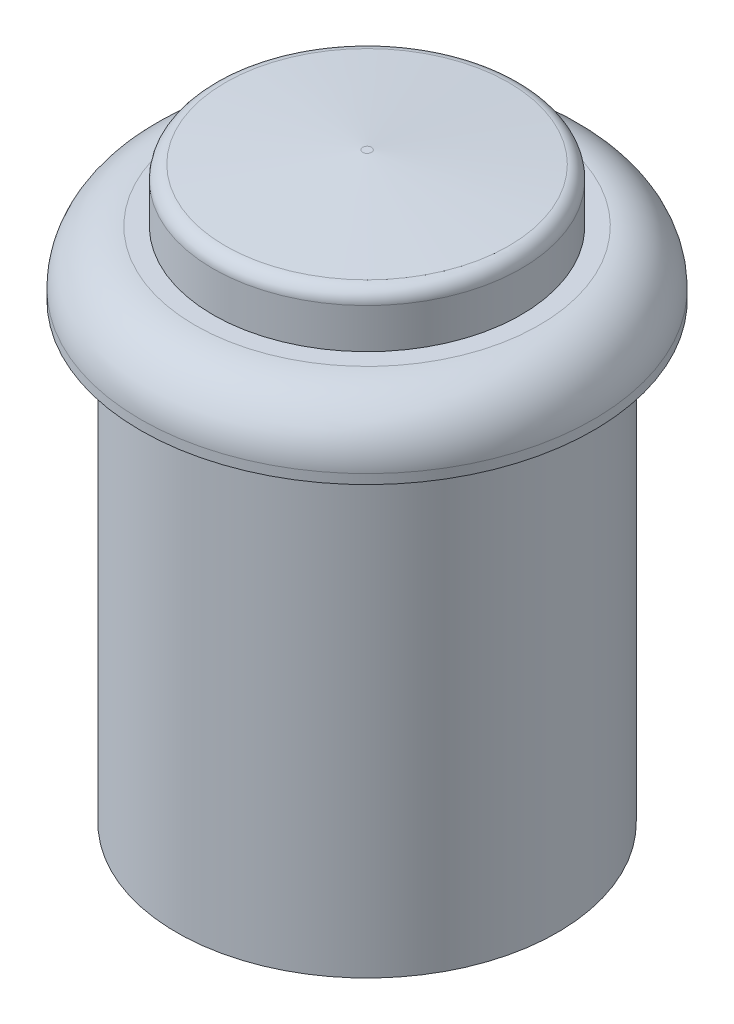
ISO-10303-21;
HEADER;
FILE_DESCRIPTION(('STEP AP214'),'2;1');
FILE_NAME('part.step','',(''),(''),'','','');
FILE_SCHEMA(('AUTOMOTIVE_DESIGN { 1 0 10303 214 1 1 1 1 }'));
ENDSEC;
DATA;
#1=APPLICATION_CONTEXT('core data for automotive mechanical design processes');
#2=APPLICATION_PROTOCOL_DEFINITION('international standard','automotive_design',2000,#1);
#3=PRODUCT_CONTEXT('',#1,'mechanical');
#4=PRODUCT('Part','Part','',(#3));
#5=PRODUCT_RELATED_PRODUCT_CATEGORY('part','',(#4));
#6=PRODUCT_DEFINITION_FORMATION('','',#4);
#7=PRODUCT_DEFINITION_CONTEXT('part definition',#1,'design');
#8=PRODUCT_DEFINITION('design','',#6,#7);
#9=PRODUCT_DEFINITION_SHAPE('','',#8);
#10=(LENGTH_UNIT() NAMED_UNIT(*) SI_UNIT(.MILLI.,.METRE.));
#11=(NAMED_UNIT(*) PLANE_ANGLE_UNIT() SI_UNIT($,.RADIAN.));
#12=(NAMED_UNIT(*) SI_UNIT($,.STERADIAN.) SOLID_ANGLE_UNIT());
#13=UNCERTAINTY_MEASURE_WITH_UNIT(LENGTH_MEASURE(1.E-05),#10,'distance_accuracy_value','');
#14=(GEOMETRIC_REPRESENTATION_CONTEXT(3) GLOBAL_UNCERTAINTY_ASSIGNED_CONTEXT((#13)) GLOBAL_UNIT_ASSIGNED_CONTEXT((#10,
#11,#12)) REPRESENTATION_CONTEXT('',''));
#15=CARTESIAN_POINT('',(0.,0.,0.));
#16=DIRECTION('',(0.,0.,1.));
#17=DIRECTION('',(1.,0.,0.));
#18=AXIS2_PLACEMENT_3D('',#15,#16,#17);
#19=CARTESIAN_POINT('',(0.,4.7,0.));
#20=DIRECTION('',(0.,-1.,0.));
#21=DIRECTION('',(0.,0.,-1.));
#22=AXIS2_PLACEMENT_3D('',#19,#20,#21);
#23=CYLINDRICAL_SURFACE('',#22,16.65);
#24=CARTESIAN_POINT('',(0.,0.7,0.));
#25=DIRECTION('',(0.,1.,0.));
#26=DIRECTION('',(0.,0.,1.));
#27=AXIS2_PLACEMENT_3D('',#24,#25,#26);
#28=CIRCLE('',#27,16.65);
#29=CARTESIAN_POINT('',(0.,0.7,16.65));
#30=VERTEX_POINT('',#29);
#31=EDGE_CURVE('E46',#30,#30,#28,.F.);
#32=ORIENTED_EDGE('',*,*,#31,.T.);
#33=EDGE_LOOP('',(#32));
#34=FACE_BOUND('',#33,.T.);
#35=CARTESIAN_POINT('',(0.,0.,0.));
#36=DIRECTION('',(0.,1.,0.));
#37=DIRECTION('',(0.,0.,1.));
#38=AXIS2_PLACEMENT_3D('',#35,#36,#37);
#39=CIRCLE('',#38,16.65);
#40=CARTESIAN_POINT('',(0.,0.,16.65));
#41=VERTEX_POINT('',#40);
#42=EDGE_CURVE('E55',#41,#41,#39,.T.);
#43=ORIENTED_EDGE('',*,*,#42,.T.);
#44=EDGE_LOOP('',(#43));
#45=FACE_BOUND('',#44,.T.);
#46=ADVANCED_FACE('F31',(#34,#45),#23,.T.);
#47=CARTESIAN_POINT('',(0.,4.7,0.));
#48=DIRECTION('',(0.,1.,0.));
#49=DIRECTION('',(0.,0.,1.));
#50=AXIS2_PLACEMENT_3D('',#47,#48,#49);
#51=PLANE('',#50);
#52=CARTESIAN_POINT('',(0.,4.7,0.));
#53=DIRECTION('',(0.,1.,0.));
#54=DIRECTION('',(0.,0.,1.));
#55=AXIS2_PLACEMENT_3D('',#52,#53,#54);
#56=CIRCLE('',#55,12.65);
#57=CARTESIAN_POINT('',(0.,4.7,12.65));
#58=VERTEX_POINT('',#57);
#59=EDGE_CURVE('E51',#58,#58,#56,.T.);
#60=ORIENTED_EDGE('',*,*,#59,.T.);
#61=EDGE_LOOP('',(#60));
#62=FACE_BOUND('',#61,.T.);
#63=CARTESIAN_POINT('',(0.,4.7,0.));
#64=DIRECTION('',(0.,1.,0.));
#65=DIRECTION('',(0.,0.,1.));
#66=AXIS2_PLACEMENT_3D('',#63,#64,#65);
#67=CIRCLE('',#66,11.325);
#68=CARTESIAN_POINT('',(0.,4.7,11.325));
#69=VERTEX_POINT('',#68);
#70=EDGE_CURVE('E58',#69,#69,#67,.T.);
#71=ORIENTED_EDGE('',*,*,#70,.F.);
#72=EDGE_LOOP('',(#71));
#73=FACE_BOUND('',#72,.T.);
#74=ADVANCED_FACE('F80',(#62,#73),#51,.T.);
#75=CARTESIAN_POINT('',(0.,0.,0.));
#76=DIRECTION('',(0.,1.,0.));
#77=DIRECTION('',(0.,0.,1.));
#78=AXIS2_PLACEMENT_3D('',#75,#76,#77);
#79=PLANE('',#78);
#80=CARTESIAN_POINT('',(0.,0.,0.));
#81=DIRECTION('',(0.,-1.,0.));
#82=DIRECTION('',(0.,0.,-1.));
#83=AXIS2_PLACEMENT_3D('',#80,#81,#82);
#84=CIRCLE('',#83,14.);
#85=CARTESIAN_POINT('',(0.,0.,-14.));
#86=VERTEX_POINT('',#85);
#87=EDGE_CURVE('E54',#86,#86,#84,.T.);
#88=ORIENTED_EDGE('',*,*,#87,.F.);
#89=EDGE_LOOP('',(#88));
#90=FACE_BOUND('',#89,.T.);
#91=ORIENTED_EDGE('',*,*,#42,.F.);
#92=EDGE_LOOP('',(#91));
#93=FACE_BOUND('',#92,.T.);
#94=ADVANCED_FACE('F76',(#90,#93),#79,.F.);
#95=CARTESIAN_POINT('',(0.,9.55,0.));
#96=DIRECTION('',(0.,-1.,0.));
#97=DIRECTION('',(0.,0.,-1.));
#98=AXIS2_PLACEMENT_3D('',#95,#96,#97);
#99=CYLINDRICAL_SURFACE('',#98,11.325);
#100=CARTESIAN_POINT('',(0.,7.63678536207388,0.));
#101=DIRECTION('',(0.,1.,0.));
#102=DIRECTION('',(0.,0.,1.));
#103=AXIS2_PLACEMENT_3D('',#100,#101,#102);
#104=CIRCLE('',#103,11.325);
#105=CARTESIAN_POINT('',(0.,7.63678536207388,11.325));
#106=VERTEX_POINT('',#105);
#107=EDGE_CURVE('E38',#106,#106,#104,.F.);
#108=ORIENTED_EDGE('',*,*,#107,.T.);
#109=EDGE_LOOP('',(#108));
#110=FACE_BOUND('',#109,.T.);
#111=ORIENTED_EDGE('',*,*,#70,.T.);
#112=EDGE_LOOP('',(#111));
#113=FACE_BOUND('',#112,.T.);
#114=ADVANCED_FACE('F79',(#110,#113),#99,.T.);
#115=CARTESIAN_POINT('',(0.,9.55,0.));
#116=DIRECTION('',(0.,1.,0.));
#117=DIRECTION('',(0.,0.,1.));
#118=AXIS2_PLACEMENT_3D('',#115,#116,#117);
#119=PLANE('',#118);
#120=CARTESIAN_POINT('',(0.,9.55,0.));
#121=DIRECTION('',(0.,1.,0.));
#122=DIRECTION('',(0.,0.,1.));
#123=AXIS2_PLACEMENT_3D('',#120,#121,#122);
#124=CIRCLE('',#123,0.32499999999959);
#125=CARTESIAN_POINT('',(0.,9.55,-0.324999999999599));
#126=VERTEX_POINT('',#125);
#127=EDGE_CURVE('E42',#126,#126,#124,.T.);
#128=ORIENTED_EDGE('',*,*,#127,.T.);
#129=EDGE_LOOP('',(#128));
#130=FACE_BOUND('',#129,.T.);
#131=ADVANCED_FACE('F72',(#130),#119,.T.);
#132=CARTESIAN_POINT('',(0.,-33.3,0.));
#133=DIRECTION('',(0.,1.,0.));
#134=DIRECTION('',(0.,0.,1.));
#135=AXIS2_PLACEMENT_3D('',#132,#133,#134);
#136=CYLINDRICAL_SURFACE('',#135,14.);
#137=CARTESIAN_POINT('',(0.,-33.3,0.));
#138=DIRECTION('',(0.,-1.,0.));
#139=DIRECTION('',(0.,0.,-1.));
#140=AXIS2_PLACEMENT_3D('',#137,#138,#139);
#141=CIRCLE('',#140,14.);
#142=CARTESIAN_POINT('',(0.,-33.3,-14.));
#143=VERTEX_POINT('',#142);
#144=EDGE_CURVE('E59',#143,#143,#141,.T.);
#145=ORIENTED_EDGE('',*,*,#144,.F.);
#146=EDGE_LOOP('',(#145));
#147=FACE_BOUND('',#146,.T.);
#148=ORIENTED_EDGE('',*,*,#87,.T.);
#149=EDGE_LOOP('',(#148));
#150=FACE_BOUND('',#149,.T.);
#151=ADVANCED_FACE('F69',(#147,#150),#136,.T.);
#152=CARTESIAN_POINT('',(0.,-33.3,0.));
#153=DIRECTION('',(0.,-1.,0.));
#154=DIRECTION('',(0.,0.,-1.));
#155=AXIS2_PLACEMENT_3D('',#152,#153,#154);
#156=PLANE('',#155);
#157=ORIENTED_EDGE('',*,*,#144,.T.);
#158=EDGE_LOOP('',(#157));
#159=FACE_BOUND('',#158,.T.);
#160=ADVANCED_FACE('F67',(#159),#156,.T.);
#161=CARTESIAN_POINT('',(0.,0.7,0.));
#162=DIRECTION('',(0.,1.,0.));
#163=DIRECTION('',(0.,0.,1.));
#164=AXIS2_PLACEMENT_3D('',#161,#162,#163);
#165=TOROIDAL_SURFACE('',#164,12.65,4.);
#166=ORIENTED_EDGE('',*,*,#31,.F.);
#167=EDGE_LOOP('',(#166));
#168=FACE_BOUND('',#167,.T.);
#169=ORIENTED_EDGE('',*,*,#59,.F.);
#170=EDGE_LOOP('',(#169));
#171=FACE_BOUND('',#170,.T.);
#172=ADVANCED_FACE('F93',(#168,#171),#165,.T.);
#173=CARTESIAN_POINT('',(0.,9.55,0.));
#174=DIRECTION('',(0.,-1.,0.));
#175=DIRECTION('',(0.,0.,-1.));
#176=AXIS2_PLACEMENT_3D('',#173,#174,#175);
#177=CONICAL_SURFACE('',#176,0.32499999999959,1.48013643959415);
#178=CARTESIAN_POINT('',(0.,8.63267856854159,0.));
#179=DIRECTION('',(0.,-1.,0.));
#180=DIRECTION('',(0.,0.,-1.));
#181=AXIS2_PLACEMENT_3D('',#178,#179,#180);
#182=CIRCLE('',#181,10.4155357460425);
#183=CARTESIAN_POINT('',(0.,8.63267856854159,-10.4155357460424));
#184=VERTEX_POINT('',#183);
#185=EDGE_CURVE('E10',#184,#184,#182,.F.);
#186=CARTESIAN_POINT('',(0.,8.63267856854159,-10.4155357460424));
#187=CARTESIAN_POINT('',(0.,8.64223400011929,-10.3104259986878));
#188=CARTESIAN_POINT('',(0.,8.65178943169698,-10.2053162513332));
#189=CARTESIAN_POINT('',(0.,8.67090029485236,-9.99509675662396));
#190=CARTESIAN_POINT('',(0.,8.68045572643005,-9.88998700926935));
#191=CARTESIAN_POINT('',(0.,8.69956658958544,-9.67976751456012));
#192=CARTESIAN_POINT('',(0.,8.70912202116313,-9.57465776720551));
#193=CARTESIAN_POINT('',(0.,8.72823288431851,-9.36443827249628));
#194=CARTESIAN_POINT('',(0.,8.7377883158962,-9.25932852514167));
#195=CARTESIAN_POINT('',(0.,8.75689917905159,-9.04910903043245));
#196=CARTESIAN_POINT('',(0.,8.76645461062928,-8.94399928307784));
#197=CARTESIAN_POINT('',(0.,8.78556547378466,-8.73377978836861));
#198=CARTESIAN_POINT('',(0.,8.79512090536235,-8.628670041014));
#199=CARTESIAN_POINT('',(0.,8.81423176851774,-8.41845054630477));
#200=CARTESIAN_POINT('',(0.,8.82378720009543,-8.31334079895016));
#201=CARTESIAN_POINT('',(0.,8.84289806325081,-8.10312130424093));
#202=CARTESIAN_POINT('',(0.,8.8524534948285,-7.99801155688632));
#203=CARTESIAN_POINT('',(0.,8.87156435798389,-7.7877920621771));
#204=CARTESIAN_POINT('',(0.,8.88111978956158,-7.68268231482248));
#205=CARTESIAN_POINT('',(0.,8.90023065271696,-7.47246282011326));
#206=CARTESIAN_POINT('',(0.,8.90978608429465,-7.36735307275865));
#207=CARTESIAN_POINT('',(0.,8.92889694745004,-7.15713357804942));
#208=CARTESIAN_POINT('',(0.,8.93845237902773,-7.05202383069481));
#209=CARTESIAN_POINT('',(0.,8.95756324218311,-6.84180433598558));
#210=CARTESIAN_POINT('',(0.,8.9671186737608,-6.73669458863097));
#211=CARTESIAN_POINT('',(0.,8.98622953691619,-6.52647509392175));
#212=CARTESIAN_POINT('',(0.,8.99578496849388,-6.42136534656713));
#213=CARTESIAN_POINT('',(0.,9.01489583164926,-6.21114585185791));
#214=CARTESIAN_POINT('',(0.,9.02445126322696,-6.1060361045033));
#215=CARTESIAN_POINT('',(0.,9.04356212638234,-5.89581660979407));
#216=CARTESIAN_POINT('',(0.,9.05311755796003,-5.79070686243946));
#217=CARTESIAN_POINT('',(0.,9.07222842111541,-5.58048736773023));
#218=CARTESIAN_POINT('',(0.,9.08178385269311,-5.47537762037562));
#219=CARTESIAN_POINT('',(0.,9.10089471584849,-5.26515812566639));
#220=CARTESIAN_POINT('',(0.,9.11045014742618,-5.16004837831178));
#221=CARTESIAN_POINT('',(0.,9.12956101058156,-4.94982888360256));
#222=CARTESIAN_POINT('',(0.,9.13911644215925,-4.84471913624794));
#223=CARTESIAN_POINT('',(0.,9.15822730531464,-4.63449964153872));
#224=CARTESIAN_POINT('',(0.,9.16778273689233,-4.5293898941841));
#225=CARTESIAN_POINT('',(0.,9.18689360004771,-4.31917039947488));
#226=CARTESIAN_POINT('',(0.,9.19644903162541,-4.21406065212027));
#227=CARTESIAN_POINT('',(0.,9.21555989478079,-4.00384115741104));
#228=CARTESIAN_POINT('',(0.,9.22511532635848,-3.89873141005643));
#229=CARTESIAN_POINT('',(0.,9.24422618951386,-3.6885119153472));
#230=CARTESIAN_POINT('',(0.,9.25378162109156,-3.58340216799259));
#231=CARTESIAN_POINT('',(0.,9.27289248424694,-3.37318267328337));
#232=CARTESIAN_POINT('',(0.,9.28244791582463,-3.26807292592875));
#233=CARTESIAN_POINT('',(0.,9.30155877898001,-3.05785343121953));
#234=CARTESIAN_POINT('',(0.,9.31111421055771,-2.95274368386492));
#235=CARTESIAN_POINT('',(0.,9.33022507371309,-2.74252418915569));
#236=CARTESIAN_POINT('',(0.,9.33978050529078,-2.63741444180108));
#237=CARTESIAN_POINT('',(0.,9.35889136844616,-2.42719494709185));
#238=CARTESIAN_POINT('',(0.,9.36844680002386,-2.32208519973724));
#239=CARTESIAN_POINT('',(0.,9.38755766317924,-2.11186570502801));
#240=CARTESIAN_POINT('',(0.,9.39711309475693,-2.0067559576734));
#241=CARTESIAN_POINT('',(0.,9.41622395791232,-1.79653646296418));
#242=CARTESIAN_POINT('',(0.,9.42577938949001,-1.69142671560956));
#243=CARTESIAN_POINT('',(0.,9.44489025264539,-1.48120722090034));
#244=CARTESIAN_POINT('',(0.,9.45444568422308,-1.37609747354573));
#245=CARTESIAN_POINT('',(0.,9.47355654737846,-1.1658779788365));
#246=CARTESIAN_POINT('',(0.,9.48311197895616,-1.06076823148189));
#247=CARTESIAN_POINT('',(0.,9.50222284211154,-0.850548736772662));
#248=CARTESIAN_POINT('',(0.,9.51177827368923,-0.745438989418049));
#249=CARTESIAN_POINT('',(0.,9.53088913684461,-0.535219494708824));
#250=CARTESIAN_POINT('',(0.,9.54044456842231,-0.430109747354212));
#251=CARTESIAN_POINT('',(0.,9.55,-0.324999999999599));
#252=B_SPLINE_CURVE_WITH_KNOTS('',3,(#186,#187,#188,#189,#190,#191,#192,#193,#194,#195,#196,
#197,#198,#199,#200,#201,#202,#203,#204,#205,#206,#207,#208,#209,#210,#211,#212,#213,#214,#215,
#216,#217,#218,#219,#220,#221,#222,#223,#224,#225,#226,#227,#228,#229,#230,#231,#232,#233,#234,
#235,#236,#237,#238,#239,#240,#241,#242,#243,#244,#245,#246,#247,#248,#249,#250,#251),
.UNSPECIFIED.,.F.,.F.,(4,2,2,2,2,2,2,2,2,2,2,2,2,2,2,2,2,2,2,2,2,2,2,2,2,2,2,2,2,2,2,2,4),(0.,
0.31662957435192,0.633259148703841,0.949888723055762,1.26651829740768,1.5831478717596,
1.89977744611152,2.21640702046344,2.53303659481536,2.84966616916728,3.1662957435192,
3.48292531787112,3.79955489222304,4.11618446657496,4.43281404092688,4.7494436152788,
5.06607318963072,5.38270276398264,5.69933233833456,6.01596191268648,6.3325914870384,
6.64922106139032,6.96585063574224,7.28248021009416,7.59910978444608,7.915739358798,
8.23236893314992,8.54899850750184,8.86562808185376,9.18225765620568,9.4988872305576,
9.81551680490952,10.1321463792614),.UNSPECIFIED.);
#253=EDGE_CURVE('BSEAM95',#184,#126,#252,.T.);
#254=ORIENTED_EDGE('',*,*,#185,.T.);
#255=ORIENTED_EDGE('',*,*,#127,.F.);
#256=ORIENTED_EDGE('',*,*,#253,.T.);
#257=ORIENTED_EDGE('',*,*,#253,.F.);
#258=EDGE_LOOP('',(#254,#256,#255,#257));
#259=FACE_BOUND('',#258,.T.);
#260=ADVANCED_FACE('F95',(#259),#177,.T.);
#261=CARTESIAN_POINT('',(0.,7.63678536207388,0.));
#262=DIRECTION('',(0.,1.,0.));
#263=DIRECTION('',(0.,0.,1.));
#264=AXIS2_PLACEMENT_3D('',#261,#262,#263);
#265=TOROIDAL_SURFACE('',#264,10.325,1.);
#266=ORIENTED_EDGE('',*,*,#185,.F.);
#267=EDGE_LOOP('',(#266));
#268=FACE_BOUND('',#267,.T.);
#269=ORIENTED_EDGE('',*,*,#107,.F.);
#270=EDGE_LOOP('',(#269));
#271=FACE_BOUND('',#270,.T.);
#272=ADVANCED_FACE('F33',(#268,#271),#265,.T.);
#273=CLOSED_SHELL('',(#46,#74,#94,#114,#131,#151,#160,#172,#260,#272));
#274=MANIFOLD_SOLID_BREP('B2',#273);
#275=ADVANCED_BREP_SHAPE_REPRESENTATION('',(#18,#274),#14);
#276=SHAPE_DEFINITION_REPRESENTATION(#9,#275);
ENDSEC;
END-ISO-10303-21;
